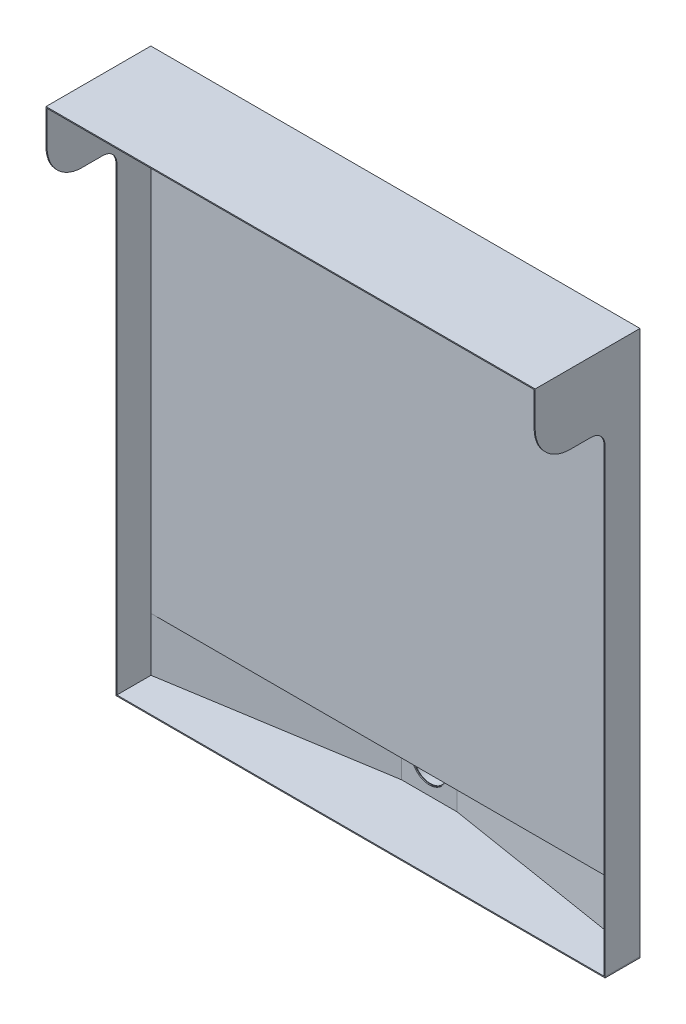
ISO-10303-21;
HEADER;
FILE_DESCRIPTION(('STEP AP214'),'2;1');
FILE_NAME('part.step','',(''),(''),'','','');
FILE_SCHEMA(('AUTOMOTIVE_DESIGN { 1 0 10303 214 1 1 1 1 }'));
ENDSEC;
DATA;
#1=APPLICATION_CONTEXT('core data for automotive mechanical design processes');
#2=APPLICATION_PROTOCOL_DEFINITION('international standard','automotive_design',2000,#1);
#3=PRODUCT_CONTEXT('',#1,'mechanical');
#4=PRODUCT('Part','Part','',(#3));
#5=PRODUCT_RELATED_PRODUCT_CATEGORY('part','',(#4));
#6=PRODUCT_DEFINITION_FORMATION('','',#4);
#7=PRODUCT_DEFINITION_CONTEXT('part definition',#1,'design');
#8=PRODUCT_DEFINITION('design','',#6,#7);
#9=PRODUCT_DEFINITION_SHAPE('','',#8);
#10=(LENGTH_UNIT() NAMED_UNIT(*) SI_UNIT(.MILLI.,.METRE.));
#11=(NAMED_UNIT(*) PLANE_ANGLE_UNIT() SI_UNIT($,.RADIAN.));
#12=(NAMED_UNIT(*) SI_UNIT($,.STERADIAN.) SOLID_ANGLE_UNIT());
#13=UNCERTAINTY_MEASURE_WITH_UNIT(LENGTH_MEASURE(1.E-05),#10,'distance_accuracy_value','');
#14=(GEOMETRIC_REPRESENTATION_CONTEXT(3) GLOBAL_UNCERTAINTY_ASSIGNED_CONTEXT((#13)) GLOBAL_UNIT_ASSIGNED_CONTEXT((#10,
#11,#12)) REPRESENTATION_CONTEXT('',''));
#15=CARTESIAN_POINT('',(0.,0.,0.));
#16=DIRECTION('',(0.,0.,1.));
#17=DIRECTION('',(1.,0.,0.));
#18=AXIS2_PLACEMENT_3D('',#15,#16,#17);
#19=CARTESIAN_POINT('',(0.,-350.,-75.));
#20=DIRECTION('',(0.,0.,-1.));
#21=DIRECTION('',(-1.,0.,0.));
#22=AXIS2_PLACEMENT_3D('',#19,#20,#21);
#23=PLANE('',#22);
#24=CARTESIAN_POINT('',(0.,-350.,-75.));
#25=DIRECTION('',(0.,0.,-1.));
#26=DIRECTION('',(-1.,0.,0.));
#27=AXIS2_PLACEMENT_3D('',#24,#25,#26);
#28=CIRCLE('',#27,25.);
#29=CARTESIAN_POINT('',(-25.,-350.,-75.));
#30=VERTEX_POINT('',#29);
#31=EDGE_CURVE('E12',#30,#30,#28,.T.);
#32=ORIENTED_EDGE('',*,*,#31,.T.);
#33=EDGE_LOOP('',(#32));
#34=FACE_BOUND('',#33,.T.);
#35=CARTESIAN_POINT('',(0.,-350.,-75.));
#36=DIRECTION('',(0.,0.,-1.));
#37=DIRECTION('',(-1.,0.,0.));
#38=AXIS2_PLACEMENT_3D('',#35,#36,#37);
#39=CIRCLE('',#38,24.);
#40=CARTESIAN_POINT('',(-24.,-350.,-75.));
#41=VERTEX_POINT('',#40);
#42=EDGE_CURVE('E73',#41,#41,#39,.T.);
#43=ORIENTED_EDGE('',*,*,#42,.F.);
#44=EDGE_LOOP('',(#43));
#45=FACE_BOUND('',#44,.T.);
#46=ADVANCED_FACE('F59',(#34,#45),#23,.T.);
#47=CARTESIAN_POINT('',(0.,-350.,-50.));
#48=DIRECTION('',(0.,0.,-1.));
#49=DIRECTION('',(-1.,0.,0.));
#50=AXIS2_PLACEMENT_3D('',#47,#48,#49);
#51=PLANE('',#50);
#52=CARTESIAN_POINT('',(0.,-350.,-50.));
#53=DIRECTION('',(0.,0.,-1.));
#54=DIRECTION('',(-1.,0.,0.));
#55=AXIS2_PLACEMENT_3D('',#52,#53,#54);
#56=CIRCLE('',#55,25.);
#57=CARTESIAN_POINT('',(-25.,-350.,-50.));
#58=VERTEX_POINT('',#57);
#59=EDGE_CURVE('E63',#58,#58,#56,.T.);
#60=ORIENTED_EDGE('',*,*,#59,.F.);
#61=EDGE_LOOP('',(#60));
#62=FACE_BOUND('',#61,.T.);
#63=CARTESIAN_POINT('',(0.,-350.,-50.));
#64=DIRECTION('',(0.,0.,-1.));
#65=DIRECTION('',(-1.,0.,0.));
#66=AXIS2_PLACEMENT_3D('',#63,#64,#65);
#67=CIRCLE('',#66,24.);
#68=CARTESIAN_POINT('',(-24.,-350.,-50.));
#69=VERTEX_POINT('',#68);
#70=EDGE_CURVE('E75',#69,#69,#67,.T.);
#71=ORIENTED_EDGE('',*,*,#70,.T.);
#72=EDGE_LOOP('',(#71));
#73=FACE_BOUND('',#72,.T.);
#74=ADVANCED_FACE('F86',(#62,#73),#51,.F.);
#75=CARTESIAN_POINT('',(0.,-350.,-75.));
#76=DIRECTION('',(0.,0.,1.));
#77=DIRECTION('',(1.,0.,0.));
#78=AXIS2_PLACEMENT_3D('',#75,#76,#77);
#79=CYLINDRICAL_SURFACE('',#78,25.);
#80=ORIENTED_EDGE('',*,*,#31,.F.);
#81=EDGE_LOOP('',(#80));
#82=FACE_BOUND('',#81,.T.);
#83=ORIENTED_EDGE('',*,*,#59,.T.);
#84=EDGE_LOOP('',(#83));
#85=FACE_BOUND('',#84,.T.);
#86=ADVANCED_FACE('F61',(#82,#85),#79,.T.);
#87=CARTESIAN_POINT('',(0.,-350.,-75.));
#88=DIRECTION('',(0.,0.,1.));
#89=DIRECTION('',(1.,0.,0.));
#90=AXIS2_PLACEMENT_3D('',#87,#88,#89);
#91=CYLINDRICAL_SURFACE('',#90,24.);
#92=ORIENTED_EDGE('',*,*,#42,.T.);
#93=EDGE_LOOP('',(#92));
#94=FACE_BOUND('',#93,.T.);
#95=ORIENTED_EDGE('',*,*,#70,.F.);
#96=EDGE_LOOP('',(#95));
#97=FACE_BOUND('',#96,.T.);
#98=ADVANCED_FACE('F82',(#94,#97),#91,.F.);
#99=CLOSED_SHELL('',(#46,#74,#86,#98));
#100=MANIFOLD_SOLID_BREP('B2',#99);
#101=CARTESIAN_POINT('',(-348.5,-388.5,150.));
#102=DIRECTION('',(0.,1.,0.));
#103=DIRECTION('',(-1.,0.,0.));
#104=AXIS2_PLACEMENT_3D('',#101,#102,#103);
#105=PLANE('',#104);
#106=DIRECTION('',(-1.,0.,0.));
#107=VECTOR('',#106,1.);
#108=CARTESIAN_POINT('',(-348.5,-388.5,50.0000000000001));
#109=LINE('',#108,#107);
#110=CARTESIAN_POINT('',(350.,-388.5,50.0000000000001));
#111=VERTEX_POINT('',#110);
#112=CARTESIAN_POINT('',(-350.,-388.5,50.0000000000001));
#113=VERTEX_POINT('',#112);
#114=EDGE_CURVE('E191',#111,#113,#109,.T.);
#115=ORIENTED_EDGE('',*,*,#114,.F.);
#116=DIRECTION('',(0.,0.,-1.));
#117=VECTOR('',#116,1.);
#118=CARTESIAN_POINT('',(350.,-388.5,150.));
#119=LINE('',#118,#117);
#120=CARTESIAN_POINT('',(350.,-388.5,0.));
#121=VERTEX_POINT('',#120);
#122=EDGE_CURVE('E199',#111,#121,#119,.T.);
#123=ORIENTED_EDGE('',*,*,#122,.T.);
#124=DIRECTION('',(0.987241120712647,0.,0.159232438824621));
#125=VECTOR('',#124,1.);
#126=CARTESIAN_POINT('',(40.0000000000001,-388.5,-50.));
#127=LINE('',#126,#125);
#128=CARTESIAN_POINT('',(40.0000000000001,-388.5,-50.));
#129=VERTEX_POINT('',#128);
#130=EDGE_CURVE('E249',#129,#121,#127,.T.);
#131=ORIENTED_EDGE('',*,*,#130,.F.);
#132=DIRECTION('',(1.,0.,0.));
#133=VECTOR('',#132,1.);
#134=CARTESIAN_POINT('',(40.0000000000001,-388.5,-50.));
#135=LINE('',#134,#133);
#136=CARTESIAN_POINT('',(-39.9999999999999,-388.5,-50.));
#137=VERTEX_POINT('',#136);
#138=EDGE_CURVE('E214',#137,#129,#135,.T.);
#139=ORIENTED_EDGE('',*,*,#138,.F.);
#140=DIRECTION('',(0.987241120712647,0.,-0.159232438824621));
#141=VECTOR('',#140,1.);
#142=CARTESIAN_POINT('',(-350.,-388.5,0.));
#143=LINE('',#142,#141);
#144=CARTESIAN_POINT('',(-350.,-388.5,0.));
#145=VERTEX_POINT('',#144);
#146=EDGE_CURVE('E212',#145,#137,#143,.T.);
#147=ORIENTED_EDGE('',*,*,#146,.F.);
#148=DIRECTION('',(0.,0.,1.));
#149=VECTOR('',#148,1.);
#150=CARTESIAN_POINT('',(-350.,-388.5,150.));
#151=LINE('',#150,#149);
#152=EDGE_CURVE('E206',#145,#113,#151,.T.);
#153=ORIENTED_EDGE('',*,*,#152,.T.);
#154=EDGE_LOOP('',(#115,#123,#131,#139,#147,#153));
#155=FACE_BOUND('',#154,.T.);
#156=ADVANCED_FACE('F138',(#155),#105,.T.);
#157=CARTESIAN_POINT('',(-350.,390.,150.));
#158=DIRECTION('',(1.,0.,0.));
#159=DIRECTION('',(0.,1.,0.));
#160=AXIS2_PLACEMENT_3D('',#157,#158,#159);
#161=PLANE('',#160);
#162=DIRECTION('',(0.,0.,-1.));
#163=VECTOR('',#162,1.);
#164=CARTESIAN_POINT('',(-350.,-390.,150.));
#165=LINE('',#164,#163);
#166=CARTESIAN_POINT('',(-350.,-390.,50.));
#167=VERTEX_POINT('',#166);
#168=CARTESIAN_POINT('',(-350.,-390.,0.));
#169=VERTEX_POINT('',#168);
#170=EDGE_CURVE('E208',#167,#169,#165,.T.);
#171=ORIENTED_EDGE('',*,*,#170,.F.);
#172=DIRECTION('',(0.,-1.,0.));
#173=VECTOR('',#172,1.);
#174=CARTESIAN_POINT('',(-350.,290.,50.));
#175=LINE('',#174,#173);
#176=EDGE_CURVE('E154',#113,#167,#175,.T.);
#177=ORIENTED_EDGE('',*,*,#176,.F.);
#178=ORIENTED_EDGE('',*,*,#152,.F.);
#179=DIRECTION('',(0.,-1.,0.));
#180=VECTOR('',#179,1.);
#181=CARTESIAN_POINT('',(-350.,-310.,0.));
#182=LINE('',#181,#180);
#183=EDGE_CURVE('E230',#145,#169,#182,.T.);
#184=ORIENTED_EDGE('',*,*,#183,.T.);
#185=EDGE_LOOP('',(#171,#177,#178,#184));
#186=FACE_BOUND('',#185,.T.);
#187=ADVANCED_FACE('F204',(#186),#161,.F.);
#188=CARTESIAN_POINT('',(350.,390.,150.));
#189=DIRECTION('',(-1.,0.,0.));
#190=DIRECTION('',(0.,-1.,0.));
#191=AXIS2_PLACEMENT_3D('',#188,#189,#190);
#192=PLANE('',#191);
#193=ORIENTED_EDGE('',*,*,#122,.F.);
#194=DIRECTION('',(0.,-1.,0.));
#195=VECTOR('',#194,1.);
#196=CARTESIAN_POINT('',(350.,290.,50.));
#197=LINE('',#196,#195);
#198=CARTESIAN_POINT('',(350.,-390.,50.0000000000001));
#199=VERTEX_POINT('',#198);
#200=EDGE_CURVE('E194',#111,#199,#197,.T.);
#201=ORIENTED_EDGE('',*,*,#200,.T.);
#202=DIRECTION('',(0.,0.,-1.));
#203=VECTOR('',#202,1.);
#204=CARTESIAN_POINT('',(350.,-390.,150.));
#205=LINE('',#204,#203);
#206=CARTESIAN_POINT('',(350.,-390.,0.));
#207=VERTEX_POINT('',#206);
#208=EDGE_CURVE('E227',#199,#207,#205,.T.);
#209=ORIENTED_EDGE('',*,*,#208,.T.);
#210=DIRECTION('',(0.,1.,0.));
#211=VECTOR('',#210,1.);
#212=CARTESIAN_POINT('',(350.,390.,0.));
#213=LINE('',#212,#211);
#214=EDGE_CURVE('E222',#207,#121,#213,.T.);
#215=ORIENTED_EDGE('',*,*,#214,.T.);
#216=EDGE_LOOP('',(#193,#201,#209,#215));
#217=FACE_BOUND('',#216,.T.);
#218=ADVANCED_FACE('F262',(#217),#192,.F.);
#219=CARTESIAN_POINT('',(40.0000000000001,-310.,-50.));
#220=DIRECTION('',(0.,0.,-1.));
#221=DIRECTION('',(-1.,0.,0.));
#222=AXIS2_PLACEMENT_3D('',#219,#220,#221);
#223=PLANE('',#222);
#224=DIRECTION('',(0.,-1.,0.));
#225=VECTOR('',#224,1.);
#226=CARTESIAN_POINT('',(-39.9999999999999,-310.,-50.));
#227=LINE('',#226,#225);
#228=CARTESIAN_POINT('',(-39.9999999999999,-390.,-50.));
#229=VERTEX_POINT('',#228);
#230=EDGE_CURVE('E226',#137,#229,#227,.T.);
#231=ORIENTED_EDGE('',*,*,#230,.F.);
#232=ORIENTED_EDGE('',*,*,#138,.T.);
#233=DIRECTION('',(0.,-1.,0.));
#234=VECTOR('',#233,1.);
#235=CARTESIAN_POINT('',(40.0000000000001,-310.,-50.));
#236=LINE('',#235,#234);
#237=CARTESIAN_POINT('',(40.0000000000001,-390.,-50.));
#238=VERTEX_POINT('',#237);
#239=EDGE_CURVE('E161',#129,#238,#236,.T.);
#240=ORIENTED_EDGE('',*,*,#239,.T.);
#241=DIRECTION('',(1.,0.,0.));
#242=VECTOR('',#241,1.);
#243=CARTESIAN_POINT('',(40.0000000000001,-390.,-50.));
#244=LINE('',#243,#242);
#245=EDGE_CURVE('E147',#229,#238,#244,.T.);
#246=ORIENTED_EDGE('',*,*,#245,.F.);
#247=EDGE_LOOP('',(#231,#232,#240,#246));
#248=FACE_BOUND('',#247,.T.);
#249=ADVANCED_FACE('F255',(#248),#223,.T.);
#250=CARTESIAN_POINT('',(-350.,-310.,0.));
#251=DIRECTION('',(-0.159232438824621,0.,-0.987241120712647));
#252=DIRECTION('',(-0.987241120712647,0.,0.159232438824621));
#253=AXIS2_PLACEMENT_3D('',#250,#251,#252);
#254=PLANE('',#253);
#255=ORIENTED_EDGE('',*,*,#183,.F.);
#256=ORIENTED_EDGE('',*,*,#146,.T.);
#257=ORIENTED_EDGE('',*,*,#230,.T.);
#258=DIRECTION('',(0.987241120712647,0.,-0.159232438824621));
#259=VECTOR('',#258,1.);
#260=CARTESIAN_POINT('',(-350.,-390.,0.));
#261=LINE('',#260,#259);
#262=EDGE_CURVE('E233',#169,#229,#261,.T.);
#263=ORIENTED_EDGE('',*,*,#262,.F.);
#264=EDGE_LOOP('',(#255,#256,#257,#263));
#265=FACE_BOUND('',#264,.T.);
#266=ADVANCED_FACE('F140',(#265),#254,.T.);
#267=CARTESIAN_POINT('',(40.0000000000001,-310.,-50.));
#268=DIRECTION('',(0.159232438824621,0.,-0.987241120712647));
#269=DIRECTION('',(-0.987241120712647,0.,-0.159232438824621));
#270=AXIS2_PLACEMENT_3D('',#267,#268,#269);
#271=PLANE('',#270);
#272=ORIENTED_EDGE('',*,*,#239,.F.);
#273=ORIENTED_EDGE('',*,*,#130,.T.);
#274=ORIENTED_EDGE('',*,*,#214,.F.);
#275=DIRECTION('',(0.987241120712647,0.,0.159232438824621));
#276=VECTOR('',#275,1.);
#277=CARTESIAN_POINT('',(40.0000000000001,-390.,-50.));
#278=LINE('',#277,#276);
#279=EDGE_CURVE('E236',#238,#207,#278,.T.);
#280=ORIENTED_EDGE('',*,*,#279,.F.);
#281=EDGE_LOOP('',(#272,#273,#274,#280));
#282=FACE_BOUND('',#281,.T.);
#283=ADVANCED_FACE('F260',(#282),#271,.T.);
#284=CARTESIAN_POINT('',(350.,-390.,150.));
#285=DIRECTION('',(0.,1.,0.));
#286=DIRECTION('',(-1.,0.,0.));
#287=AXIS2_PLACEMENT_3D('',#284,#285,#286);
#288=PLANE('',#287);
#289=ORIENTED_EDGE('',*,*,#208,.F.);
#290=DIRECTION('',(-1.,0.,0.));
#291=VECTOR('',#290,1.);
#292=CARTESIAN_POINT('',(350.,-390.,50.0000000000001));
#293=LINE('',#292,#291);
#294=EDGE_CURVE('E57',#199,#167,#293,.T.);
#295=ORIENTED_EDGE('',*,*,#294,.T.);
#296=ORIENTED_EDGE('',*,*,#170,.T.);
#297=ORIENTED_EDGE('',*,*,#262,.T.);
#298=ORIENTED_EDGE('',*,*,#245,.T.);
#299=ORIENTED_EDGE('',*,*,#279,.T.);
#300=EDGE_LOOP('',(#289,#295,#296,#297,#298,#299));
#301=FACE_BOUND('',#300,.T.);
#302=ADVANCED_FACE('F257',(#301),#288,.F.);
#303=CARTESIAN_POINT('',(350.,290.,50.));
#304=DIRECTION('',(0.,0.,-1.));
#305=DIRECTION('',(0.,1.,0.));
#306=AXIS2_PLACEMENT_3D('',#303,#304,#305);
#307=PLANE('',#306);
#308=ORIENTED_EDGE('',*,*,#114,.T.);
#309=ORIENTED_EDGE('',*,*,#176,.T.);
#310=ORIENTED_EDGE('',*,*,#294,.F.);
#311=ORIENTED_EDGE('',*,*,#200,.F.);
#312=EDGE_LOOP('',(#308,#309,#310,#311));
#313=FACE_BOUND('',#312,.T.);
#314=ADVANCED_FACE('F192',(#313),#307,.F.);
#315=CLOSED_SHELL('',(#156,#187,#218,#249,#266,#283,#302,#314));
#316=MANIFOLD_SOLID_BREP('B7',#315);
#317=CARTESIAN_POINT('',(0.,0.,150.));
#318=DIRECTION('',(0.,0.,-1.));
#319=DIRECTION('',(-1.,0.,0.));
#320=AXIS2_PLACEMENT_3D('',#317,#318,#319);
#321=PLANE('',#320);
#322=DIRECTION('',(0.,1.,0.));
#323=VECTOR('',#322,1.);
#324=CARTESIAN_POINT('',(348.5,0.,150.));
#325=LINE('',#324,#323);
#326=CARTESIAN_POINT('',(348.5,340.,150.));
#327=VERTEX_POINT('',#326);
#328=CARTESIAN_POINT('',(348.5,388.5,150.));
#329=VERTEX_POINT('',#328);
#330=EDGE_CURVE('E718',#327,#329,#325,.T.);
#331=ORIENTED_EDGE('',*,*,#330,.F.);
#332=DIRECTION('',(-1.,0.,0.));
#333=VECTOR('',#332,1.);
#334=CARTESIAN_POINT('',(350.,340.,150.));
#335=LINE('',#334,#333);
#336=CARTESIAN_POINT('',(350.,340.,150.));
#337=VERTEX_POINT('',#336);
#338=EDGE_CURVE('E592',#327,#337,#335,.F.);
#339=ORIENTED_EDGE('',*,*,#338,.T.);
#340=DIRECTION('',(0.,1.,0.));
#341=VECTOR('',#340,1.);
#342=CARTESIAN_POINT('',(350.,390.,150.));
#343=LINE('',#342,#341);
#344=CARTESIAN_POINT('',(350.,390.,150.));
#345=VERTEX_POINT('',#344);
#346=EDGE_CURVE('E613',#337,#345,#343,.T.);
#347=ORIENTED_EDGE('',*,*,#346,.T.);
#348=DIRECTION('',(-1.,0.,0.));
#349=VECTOR('',#348,1.);
#350=CARTESIAN_POINT('',(350.,390.,150.));
#351=LINE('',#350,#349);
#352=CARTESIAN_POINT('',(-350.,390.,150.));
#353=VERTEX_POINT('',#352);
#354=EDGE_CURVE('E610',#345,#353,#351,.T.);
#355=ORIENTED_EDGE('',*,*,#354,.T.);
#356=DIRECTION('',(0.,-1.,0.));
#357=VECTOR('',#356,1.);
#358=CARTESIAN_POINT('',(-350.,390.,150.));
#359=LINE('',#358,#357);
#360=CARTESIAN_POINT('',(-350.,340.,150.));
#361=VERTEX_POINT('',#360);
#362=EDGE_CURVE('E604',#353,#361,#359,.T.);
#363=ORIENTED_EDGE('',*,*,#362,.T.);
#364=DIRECTION('',(-1.,0.,0.));
#365=VECTOR('',#364,1.);
#366=CARTESIAN_POINT('',(-348.5,340.,150.));
#367=LINE('',#366,#365);
#368=CARTESIAN_POINT('',(-348.5,340.,150.));
#369=VERTEX_POINT('',#368);
#370=EDGE_CURVE('E589',#361,#369,#367,.F.);
#371=ORIENTED_EDGE('',*,*,#370,.T.);
#372=DIRECTION('',(0.,-1.,0.));
#373=VECTOR('',#372,1.);
#374=CARTESIAN_POINT('',(-348.5,0.,150.));
#375=LINE('',#374,#373);
#376=CARTESIAN_POINT('',(-348.5,388.5,150.));
#377=VERTEX_POINT('',#376);
#378=EDGE_CURVE('E660',#377,#369,#375,.T.);
#379=ORIENTED_EDGE('',*,*,#378,.F.);
#380=DIRECTION('',(-1.,0.,0.));
#381=VECTOR('',#380,1.);
#382=CARTESIAN_POINT('',(0.,388.5,150.));
#383=LINE('',#382,#381);
#384=EDGE_CURVE('E674',#329,#377,#383,.T.);
#385=ORIENTED_EDGE('',*,*,#384,.F.);
#386=EDGE_LOOP('',(#331,#339,#347,#355,#363,#371,#379,#385));
#387=FACE_BOUND('',#386,.T.);
#388=ADVANCED_FACE('F352',(#387),#321,.F.);
#389=CARTESIAN_POINT('',(-348.5,-388.5,150.));
#390=DIRECTION('',(0.,1.,0.));
#391=DIRECTION('',(-1.,0.,0.));
#392=AXIS2_PLACEMENT_3D('',#389,#390,#391);
#393=PLANE('',#392);
#394=DIRECTION('',(0.,0.,-1.));
#395=VECTOR('',#394,1.);
#396=CARTESIAN_POINT('',(350.,-388.5,150.));
#397=LINE('',#396,#395);
#398=CARTESIAN_POINT('',(350.,-388.5,50.0000000000001));
#399=VERTEX_POINT('',#398);
#400=CARTESIAN_POINT('',(350.,-388.5,0.));
#401=VERTEX_POINT('',#400);
#402=EDGE_CURVE('E543',#399,#401,#397,.T.);
#403=ORIENTED_EDGE('',*,*,#402,.F.);
#404=DIRECTION('',(-1.,0.,0.));
#405=VECTOR('',#404,1.);
#406=CARTESIAN_POINT('',(-348.5,-388.5,50.0000000000001));
#407=LINE('',#406,#405);
#408=CARTESIAN_POINT('',(348.5,-388.5,50.0000000000001));
#409=VERTEX_POINT('',#408);
#410=EDGE_CURVE('E535',#399,#409,#407,.T.);
#411=ORIENTED_EDGE('',*,*,#410,.T.);
#412=DIRECTION('',(0.,0.,-1.));
#413=VECTOR('',#412,1.);
#414=CARTESIAN_POINT('',(348.5,-388.5,150.));
#415=LINE('',#414,#413);
#416=CARTESIAN_POINT('',(348.5,-388.5,1.277450174333));
#417=VERTEX_POINT('',#416);
#418=EDGE_CURVE('E559',#409,#417,#415,.T.);
#419=ORIENTED_EDGE('',*,*,#418,.T.);
#420=DIRECTION('',(0.987241120712647,0.,0.159232438824621));
#421=VECTOR('',#420,1.);
#422=CARTESIAN_POINT('',(39.7611513417631,-388.5,-48.519138318931));
#423=LINE('',#422,#421);
#424=CARTESIAN_POINT('',(39.8798089191355,-388.5,-48.5));
#425=VERTEX_POINT('',#424);
#426=EDGE_CURVE('E679',#425,#417,#423,.T.);
#427=ORIENTED_EDGE('',*,*,#426,.F.);
#428=DIRECTION('',(1.,0.,0.));
#429=VECTOR('',#428,1.);
#430=CARTESIAN_POINT('',(40.0000000000001,-388.5,-48.5));
#431=LINE('',#430,#429);
#432=CARTESIAN_POINT('',(-39.8798089191354,-388.5,-48.5));
#433=VERTEX_POINT('',#432);
#434=EDGE_CURVE('E680',#433,#425,#431,.T.);
#435=ORIENTED_EDGE('',*,*,#434,.F.);
#436=DIRECTION('',(0.987241120712647,0.,-0.159232438824621));
#437=VECTOR('',#436,1.);
#438=CARTESIAN_POINT('',(-349.761151341763,-388.5,1.48086168106897));
#439=LINE('',#438,#437);
#440=CARTESIAN_POINT('',(-348.5,-388.5,1.27745017433299));
#441=VERTEX_POINT('',#440);
#442=EDGE_CURVE('E675',#441,#433,#439,.T.);
#443=ORIENTED_EDGE('',*,*,#442,.F.);
#444=DIRECTION('',(0.,0.,-1.));
#445=VECTOR('',#444,1.);
#446=CARTESIAN_POINT('',(-348.5,-388.5,150.));
#447=LINE('',#446,#445);
#448=CARTESIAN_POINT('',(-348.5,-388.5,50.0000000000001));
#449=VERTEX_POINT('',#448);
#450=EDGE_CURVE('E530',#449,#441,#447,.T.);
#451=ORIENTED_EDGE('',*,*,#450,.F.);
#452=CARTESIAN_POINT('',(-350.,-388.5,50.0000000000001));
#453=VERTEX_POINT('',#452);
#454=EDGE_CURVE('E511',#449,#453,#407,.T.);
#455=ORIENTED_EDGE('',*,*,#454,.T.);
#456=DIRECTION('',(0.,0.,1.));
#457=VECTOR('',#456,1.);
#458=CARTESIAN_POINT('',(-350.,-388.5,150.));
#459=LINE('',#458,#457);
#460=CARTESIAN_POINT('',(-350.,-388.5,0.));
#461=VERTEX_POINT('',#460);
#462=EDGE_CURVE('E527',#461,#453,#459,.T.);
#463=ORIENTED_EDGE('',*,*,#462,.F.);
#464=DIRECTION('',(0.987241120712647,0.,-0.159232438824621));
#465=VECTOR('',#464,1.);
#466=CARTESIAN_POINT('',(-350.,-388.5,0.));
#467=LINE('',#466,#465);
#468=CARTESIAN_POINT('',(-39.9999999999999,-388.5,-50.));
#469=VERTEX_POINT('',#468);
#470=EDGE_CURVE('E549',#461,#469,#467,.T.);
#471=ORIENTED_EDGE('',*,*,#470,.T.);
#472=DIRECTION('',(1.,0.,0.));
#473=VECTOR('',#472,1.);
#474=CARTESIAN_POINT('',(40.0000000000001,-388.5,-50.));
#475=LINE('',#474,#473);
#476=CARTESIAN_POINT('',(40.0000000000001,-388.5,-50.));
#477=VERTEX_POINT('',#476);
#478=EDGE_CURVE('E542',#469,#477,#475,.T.);
#479=ORIENTED_EDGE('',*,*,#478,.T.);
#480=DIRECTION('',(0.987241120712647,0.,0.159232438824621));
#481=VECTOR('',#480,1.);
#482=CARTESIAN_POINT('',(40.0000000000001,-388.5,-50.));
#483=LINE('',#482,#481);
#484=EDGE_CURVE('E688',#477,#401,#483,.T.);
#485=ORIENTED_EDGE('',*,*,#484,.T.);
#486=EDGE_LOOP('',(#403,#411,#419,#427,#435,#443,#451,#455,#463,#471,#479,#485));
#487=FACE_BOUND('',#486,.T.);
#488=ADVANCED_FACE('F525',(#487),#393,.F.);
#489=CARTESIAN_POINT('',(350.,390.,150.));
#490=DIRECTION('',(0.,-1.,0.));
#491=DIRECTION('',(1.,0.,0.));
#492=AXIS2_PLACEMENT_3D('',#489,#490,#491);
#493=PLANE('',#492);
#494=DIRECTION('',(-1.,0.,0.));
#495=VECTOR('',#494,1.);
#496=CARTESIAN_POINT('',(350.,390.,0.));
#497=LINE('',#496,#495);
#498=CARTESIAN_POINT('',(350.,390.,0.));
#499=VERTEX_POINT('',#498);
#500=CARTESIAN_POINT('',(-350.,390.,0.));
#501=VERTEX_POINT('',#500);
#502=EDGE_CURVE('E614',#499,#501,#497,.T.);
#503=ORIENTED_EDGE('',*,*,#502,.T.);
#504=DIRECTION('',(0.,0.,-1.));
#505=VECTOR('',#504,1.);
#506=CARTESIAN_POINT('',(-350.,390.,150.));
#507=LINE('',#506,#505);
#508=EDGE_CURVE('E751',#353,#501,#507,.T.);
#509=ORIENTED_EDGE('',*,*,#508,.F.);
#510=ORIENTED_EDGE('',*,*,#354,.F.);
#511=DIRECTION('',(0.,0.,-1.));
#512=VECTOR('',#511,1.);
#513=CARTESIAN_POINT('',(350.,390.,150.));
#514=LINE('',#513,#512);
#515=EDGE_CURVE('E552',#345,#499,#514,.T.);
#516=ORIENTED_EDGE('',*,*,#515,.T.);
#517=EDGE_LOOP('',(#503,#509,#510,#516));
#518=FACE_BOUND('',#517,.T.);
#519=ADVANCED_FACE('F794',(#518),#493,.F.);
#520=CARTESIAN_POINT('',(0.,0.,0.));
#521=DIRECTION('',(0.,0.,-1.));
#522=DIRECTION('',(-1.,0.,0.));
#523=AXIS2_PLACEMENT_3D('',#520,#521,#522);
#524=PLANE('',#523);
#525=DIRECTION('',(0.,1.,0.));
#526=VECTOR('',#525,1.);
#527=CARTESIAN_POINT('',(350.,390.,0.));
#528=LINE('',#527,#526);
#529=CARTESIAN_POINT('',(350.,-310.,0.));
#530=VERTEX_POINT('',#529);
#531=EDGE_CURVE('E754',#530,#499,#528,.T.);
#532=ORIENTED_EDGE('',*,*,#531,.F.);
#533=DIRECTION('',(-1.,0.,0.));
#534=VECTOR('',#533,1.);
#535=CARTESIAN_POINT('',(350.,-310.,0.));
#536=LINE('',#535,#534);
#537=CARTESIAN_POINT('',(-350.,-310.,0.));
#538=VERTEX_POINT('',#537);
#539=EDGE_CURVE('E730',#530,#538,#536,.T.);
#540=ORIENTED_EDGE('',*,*,#539,.T.);
#541=DIRECTION('',(0.,-1.,0.));
#542=VECTOR('',#541,1.);
#543=CARTESIAN_POINT('',(-350.,390.,0.));
#544=LINE('',#543,#542);
#545=EDGE_CURVE('E742',#501,#538,#544,.T.);
#546=ORIENTED_EDGE('',*,*,#545,.F.);
#547=ORIENTED_EDGE('',*,*,#502,.F.);
#548=EDGE_LOOP('',(#532,#540,#546,#547));
#549=FACE_BOUND('',#548,.T.);
#550=ADVANCED_FACE('F786',(#549),#524,.T.);
#551=CARTESIAN_POINT('',(0.,0.,1.5));
#552=DIRECTION('',(0.,0.,-1.));
#553=DIRECTION('',(-1.,0.,0.));
#554=AXIS2_PLACEMENT_3D('',#551,#552,#553);
#555=PLANE('',#554);
#556=DIRECTION('',(0.,1.,0.));
#557=VECTOR('',#556,1.);
#558=CARTESIAN_POINT('',(348.5,0.,1.5));
#559=LINE('',#558,#557);
#560=CARTESIAN_POINT('',(348.5,-311.5,1.5));
#561=VERTEX_POINT('',#560);
#562=CARTESIAN_POINT('',(348.5,388.5,1.5));
#563=VERTEX_POINT('',#562);
#564=EDGE_CURVE('E642',#561,#563,#559,.T.);
#565=ORIENTED_EDGE('',*,*,#564,.T.);
#566=DIRECTION('',(-1.,0.,0.));
#567=VECTOR('',#566,1.);
#568=CARTESIAN_POINT('',(0.,388.5,1.5));
#569=LINE('',#568,#567);
#570=CARTESIAN_POINT('',(-348.5,388.5,1.5));
#571=VERTEX_POINT('',#570);
#572=EDGE_CURVE('E657',#563,#571,#569,.T.);
#573=ORIENTED_EDGE('',*,*,#572,.T.);
#574=DIRECTION('',(0.,-1.,0.));
#575=VECTOR('',#574,1.);
#576=CARTESIAN_POINT('',(-348.5,0.,1.5));
#577=LINE('',#576,#575);
#578=CARTESIAN_POINT('',(-348.5,-311.5,1.5));
#579=VERTEX_POINT('',#578);
#580=EDGE_CURVE('E646',#571,#579,#577,.T.);
#581=ORIENTED_EDGE('',*,*,#580,.T.);
#582=DIRECTION('',(-1.,0.,0.));
#583=VECTOR('',#582,1.);
#584=CARTESIAN_POINT('',(0.,-311.5,1.5));
#585=LINE('',#584,#583);
#586=EDGE_CURVE('E647',#561,#579,#585,.T.);
#587=ORIENTED_EDGE('',*,*,#586,.F.);
#588=EDGE_LOOP('',(#565,#573,#581,#587));
#589=FACE_BOUND('',#588,.T.);
#590=ADVANCED_FACE('F800',(#589),#555,.F.);
#591=CARTESIAN_POINT('',(350.,388.5,150.));
#592=DIRECTION('',(0.,-1.,0.));
#593=DIRECTION('',(1.,0.,0.));
#594=AXIS2_PLACEMENT_3D('',#591,#592,#593);
#595=PLANE('',#594);
#596=ORIENTED_EDGE('',*,*,#572,.F.);
#597=DIRECTION('',(0.,0.,-1.));
#598=VECTOR('',#597,1.);
#599=CARTESIAN_POINT('',(348.5,388.5,150.));
#600=LINE('',#599,#598);
#601=EDGE_CURVE('E669',#329,#563,#600,.T.);
#602=ORIENTED_EDGE('',*,*,#601,.F.);
#603=ORIENTED_EDGE('',*,*,#384,.T.);
#604=DIRECTION('',(0.,0.,-1.));
#605=VECTOR('',#604,1.);
#606=CARTESIAN_POINT('',(-348.5,388.5,150.));
#607=LINE('',#606,#605);
#608=EDGE_CURVE('E670',#377,#571,#607,.T.);
#609=ORIENTED_EDGE('',*,*,#608,.T.);
#610=EDGE_LOOP('',(#596,#602,#603,#609));
#611=FACE_BOUND('',#610,.T.);
#612=ADVANCED_FACE('F837',(#611),#595,.T.);
#613=CARTESIAN_POINT('',(0.,-350.,150.));
#614=DIRECTION('',(0.,0.,-1.));
#615=DIRECTION('',(-1.,0.,0.));
#616=AXIS2_PLACEMENT_3D('',#613,#614,#615);
#617=CYLINDRICAL_SURFACE('',#616,25.);
#618=CARTESIAN_POINT('',(0.,-350.,-50.));
#619=DIRECTION('',(0.,0.,-1.));
#620=DIRECTION('',(-1.,0.,0.));
#621=AXIS2_PLACEMENT_3D('',#618,#619,#620);
#622=CIRCLE('',#621,25.);
#623=CARTESIAN_POINT('',(-25.,-350.,-50.));
#624=VERTEX_POINT('',#623);
#625=EDGE_CURVE('E532',#624,#624,#622,.T.);
#626=ORIENTED_EDGE('',*,*,#625,.T.);
#627=EDGE_LOOP('',(#626));
#628=FACE_BOUND('',#627,.T.);
#629=CARTESIAN_POINT('',(0.,-350.,-48.5));
#630=DIRECTION('',(0.,0.,-1.));
#631=DIRECTION('',(-1.,0.,0.));
#632=AXIS2_PLACEMENT_3D('',#629,#630,#631);
#633=CIRCLE('',#632,25.);
#634=CARTESIAN_POINT('',(-25.,-350.,-48.5));
#635=VERTEX_POINT('',#634);
#636=EDGE_CURVE('E641',#635,#635,#633,.T.);
#637=ORIENTED_EDGE('',*,*,#636,.F.);
#638=EDGE_LOOP('',(#637));
#639=FACE_BOUND('',#638,.T.);
#640=ADVANCED_FACE('F840',(#628,#639),#617,.F.);
#641=CARTESIAN_POINT('',(-348.5,390.,150.));
#642=DIRECTION('',(1.,0.,0.));
#643=DIRECTION('',(0.,1.,0.));
#644=AXIS2_PLACEMENT_3D('',#641,#642,#643);
#645=PLANE('',#644);
#646=ORIENTED_EDGE('',*,*,#378,.T.);
#647=CARTESIAN_POINT('',(-348.5,340.,100.));
#648=DIRECTION('',(1.,0.,0.));
#649=DIRECTION('',(0.,1.,0.));
#650=AXIS2_PLACEMENT_3D('',#647,#648,#649);
#651=CIRCLE('',#650,50.);
#652=CARTESIAN_POINT('',(-348.5,290.,100.));
#653=VERTEX_POINT('',#652);
#654=EDGE_CURVE('E136',#369,#653,#651,.T.);
#655=ORIENTED_EDGE('',*,*,#654,.T.);
#656=DIRECTION('',(0.,0.,-1.));
#657=VECTOR('',#656,1.);
#658=CARTESIAN_POINT('',(-348.5,290.,150.));
#659=LINE('',#658,#657);
#660=CARTESIAN_POINT('',(-348.5,290.,70.));
#661=VERTEX_POINT('',#660);
#662=EDGE_CURVE('E619',#653,#661,#659,.T.);
#663=ORIENTED_EDGE('',*,*,#662,.T.);
#664=CARTESIAN_POINT('',(-348.5,270.,70.));
#665=DIRECTION('',(1.,0.,0.));
#666=DIRECTION('',(0.,1.,0.));
#667=AXIS2_PLACEMENT_3D('',#664,#665,#666);
#668=CIRCLE('',#667,20.);
#669=CARTESIAN_POINT('',(-348.5,270.,50.));
#670=VERTEX_POINT('',#669);
#671=EDGE_CURVE('E573',#661,#670,#668,.F.);
#672=ORIENTED_EDGE('',*,*,#671,.T.);
#673=DIRECTION('',(0.,1.,0.));
#674=VECTOR('',#673,1.);
#675=CARTESIAN_POINT('',(-348.5,390.,50.));
#676=LINE('',#675,#674);
#677=EDGE_CURVE('E533',#449,#670,#676,.T.);
#678=ORIENTED_EDGE('',*,*,#677,.F.);
#679=ORIENTED_EDGE('',*,*,#450,.T.);
#680=DIRECTION('',(0.,-1.,0.));
#681=VECTOR('',#680,1.);
#682=CARTESIAN_POINT('',(-348.5,-310.,1.27745017433299));
#683=LINE('',#682,#681);
#684=CARTESIAN_POINT('',(-348.5,-311.5,1.27745017433298));
#685=VERTEX_POINT('',#684);
#686=EDGE_CURVE('E661',#685,#441,#683,.T.);
#687=ORIENTED_EDGE('',*,*,#686,.F.);
#688=DIRECTION('',(0.,0.,-1.));
#689=VECTOR('',#688,1.);
#690=CARTESIAN_POINT('',(-348.5,-311.5,149.999999999999));
#691=LINE('',#690,#689);
#692=EDGE_CURVE('E711',#579,#685,#691,.T.);
#693=ORIENTED_EDGE('',*,*,#692,.F.);
#694=ORIENTED_EDGE('',*,*,#580,.F.);
#695=ORIENTED_EDGE('',*,*,#608,.F.);
#696=EDGE_LOOP('',(#646,#655,#663,#672,#678,#679,#687,#693,#694,#695));
#697=FACE_BOUND('',#696,.T.);
#698=ADVANCED_FACE('F835',(#697),#645,.T.);
#699=CARTESIAN_POINT('',(40.0000000000001,-310.,-48.5));
#700=DIRECTION('',(0.,0.,-1.));
#701=DIRECTION('',(-1.,0.,0.));
#702=AXIS2_PLACEMENT_3D('',#699,#700,#701);
#703=PLANE('',#702);
#704=ORIENTED_EDGE('',*,*,#636,.T.);
#705=EDGE_LOOP('',(#704));
#706=FACE_BOUND('',#705,.T.);
#707=ORIENTED_EDGE('',*,*,#434,.T.);
#708=DIRECTION('',(0.,-1.,0.));
#709=VECTOR('',#708,1.);
#710=CARTESIAN_POINT('',(39.8798089191355,-310.,-48.5));
#711=LINE('',#710,#709);
#712=CARTESIAN_POINT('',(39.8798089191355,-311.5,-48.5));
#713=VERTEX_POINT('',#712);
#714=EDGE_CURVE('E665',#713,#425,#711,.T.);
#715=ORIENTED_EDGE('',*,*,#714,.F.);
#716=DIRECTION('',(1.,0.,0.));
#717=VECTOR('',#716,1.);
#718=CARTESIAN_POINT('',(0.,-311.5,-48.5));
#719=LINE('',#718,#717);
#720=CARTESIAN_POINT('',(-39.8798089191354,-311.5,-48.5));
#721=VERTEX_POINT('',#720);
#722=EDGE_CURVE('E678',#721,#713,#719,.T.);
#723=ORIENTED_EDGE('',*,*,#722,.F.);
#724=DIRECTION('',(0.,-1.,0.));
#725=VECTOR('',#724,1.);
#726=CARTESIAN_POINT('',(-39.8798089191354,-310.,-48.5));
#727=LINE('',#726,#725);
#728=EDGE_CURVE('E656',#721,#433,#727,.T.);
#729=ORIENTED_EDGE('',*,*,#728,.T.);
#730=EDGE_LOOP('',(#707,#715,#723,#729));
#731=FACE_BOUND('',#730,.T.);
#732=ADVANCED_FACE('F823',(#706,#731),#703,.F.);
#733=CARTESIAN_POINT('',(0.,-311.5,-4.34652314140749E-13));
#734=DIRECTION('',(0.,-1.,0.));
#735=DIRECTION('',(0.,0.,-1.));
#736=AXIS2_PLACEMENT_3D('',#733,#734,#735);
#737=PLANE('',#736);
#738=ORIENTED_EDGE('',*,*,#722,.T.);
#739=DIRECTION('',(0.987241120712647,0.,0.159232438824621));
#740=VECTOR('',#739,1.);
#741=CARTESIAN_POINT('',(8.63539069267576,-311.5,-53.5394222945903));
#742=LINE('',#741,#740);
#743=CARTESIAN_POINT('',(348.5,-311.5,1.27745017433301));
#744=VERTEX_POINT('',#743);
#745=EDGE_CURVE('E652',#713,#744,#742,.T.);
#746=ORIENTED_EDGE('',*,*,#745,.T.);
#747=DIRECTION('',(0.,0.,-1.));
#748=VECTOR('',#747,1.);
#749=CARTESIAN_POINT('',(348.5,-311.5,-4.34652314140749E-13));
#750=LINE('',#749,#748);
#751=EDGE_CURVE('E668',#561,#744,#750,.T.);
#752=ORIENTED_EDGE('',*,*,#751,.F.);
#753=ORIENTED_EDGE('',*,*,#586,.T.);
#754=ORIENTED_EDGE('',*,*,#692,.T.);
#755=DIRECTION('',(0.987241120712647,0.,-0.159232438824621));
#756=VECTOR('',#755,1.);
#757=CARTESIAN_POINT('',(-8.6353906926758,-311.5,-53.5394222945903));
#758=LINE('',#757,#756);
#759=EDGE_CURVE('E651',#685,#721,#758,.T.);
#760=ORIENTED_EDGE('',*,*,#759,.T.);
#761=EDGE_LOOP('',(#738,#746,#752,#753,#754,#760));
#762=FACE_BOUND('',#761,.T.);
#763=ADVANCED_FACE('F819',(#762),#737,.T.);
#764=CARTESIAN_POINT('',(348.5,390.,150.));
#765=DIRECTION('',(-1.,0.,0.));
#766=DIRECTION('',(0.,-1.,0.));
#767=AXIS2_PLACEMENT_3D('',#764,#765,#766);
#768=PLANE('',#767);
#769=DIRECTION('',(0.,0.,1.));
#770=VECTOR('',#769,1.);
#771=CARTESIAN_POINT('',(348.5,290.,150.));
#772=LINE('',#771,#770);
#773=CARTESIAN_POINT('',(348.5,290.,70.));
#774=VERTEX_POINT('',#773);
#775=CARTESIAN_POINT('',(348.5,290.,100.));
#776=VERTEX_POINT('',#775);
#777=EDGE_CURVE('E623',#774,#776,#772,.T.);
#778=ORIENTED_EDGE('',*,*,#777,.T.);
#779=CARTESIAN_POINT('',(348.5,340.,100.));
#780=DIRECTION('',(-1.,0.,0.));
#781=DIRECTION('',(0.,-1.,0.));
#782=AXIS2_PLACEMENT_3D('',#779,#780,#781);
#783=CIRCLE('',#782,50.);
#784=EDGE_CURVE('E586',#776,#327,#783,.T.);
#785=ORIENTED_EDGE('',*,*,#784,.T.);
#786=ORIENTED_EDGE('',*,*,#330,.T.);
#787=ORIENTED_EDGE('',*,*,#601,.T.);
#788=ORIENTED_EDGE('',*,*,#564,.F.);
#789=ORIENTED_EDGE('',*,*,#751,.T.);
#790=DIRECTION('',(0.,1.,0.));
#791=VECTOR('',#790,1.);
#792=CARTESIAN_POINT('',(348.5,-310.,1.27745017433301));
#793=LINE('',#792,#791);
#794=EDGE_CURVE('E645',#417,#744,#793,.T.);
#795=ORIENTED_EDGE('',*,*,#794,.F.);
#796=ORIENTED_EDGE('',*,*,#418,.F.);
#797=DIRECTION('',(0.,-1.,0.));
#798=VECTOR('',#797,1.);
#799=CARTESIAN_POINT('',(348.5,390.,50.));
#800=LINE('',#799,#798);
#801=CARTESIAN_POINT('',(348.5,270.,50.));
#802=VERTEX_POINT('',#801);
#803=EDGE_CURVE('E622',#802,#409,#800,.T.);
#804=ORIENTED_EDGE('',*,*,#803,.F.);
#805=CARTESIAN_POINT('',(348.5,270.,70.));
#806=DIRECTION('',(-1.,0.,0.));
#807=DIRECTION('',(0.,-1.,0.));
#808=AXIS2_PLACEMENT_3D('',#805,#806,#807);
#809=CIRCLE('',#808,20.);
#810=EDGE_CURVE('E576',#802,#774,#809,.F.);
#811=ORIENTED_EDGE('',*,*,#810,.T.);
#812=EDGE_LOOP('',(#778,#785,#786,#787,#788,#789,#795,#796,#804,#811));
#813=FACE_BOUND('',#812,.T.);
#814=ADVANCED_FACE('F822',(#813),#768,.T.);
#815=CARTESIAN_POINT('',(39.7611513417631,-310.,-48.519138318931));
#816=DIRECTION('',(0.159232438824621,0.,-0.987241120712647));
#817=DIRECTION('',(-0.987241120712647,0.,-0.159232438824621));
#818=AXIS2_PLACEMENT_3D('',#815,#816,#817);
#819=PLANE('',#818);
#820=ORIENTED_EDGE('',*,*,#426,.T.);
#821=ORIENTED_EDGE('',*,*,#794,.T.);
#822=ORIENTED_EDGE('',*,*,#745,.F.);
#823=ORIENTED_EDGE('',*,*,#714,.T.);
#824=EDGE_LOOP('',(#820,#821,#822,#823));
#825=FACE_BOUND('',#824,.T.);
#826=ADVANCED_FACE('F825',(#825),#819,.F.);
#827=CARTESIAN_POINT('',(-349.761151341763,-310.,1.48086168106897));
#828=DIRECTION('',(-0.159232438824621,0.,-0.987241120712647));
#829=DIRECTION('',(-0.987241120712647,0.,0.159232438824621));
#830=AXIS2_PLACEMENT_3D('',#827,#828,#829);
#831=PLANE('',#830);
#832=ORIENTED_EDGE('',*,*,#442,.T.);
#833=ORIENTED_EDGE('',*,*,#728,.F.);
#834=ORIENTED_EDGE('',*,*,#759,.F.);
#835=ORIENTED_EDGE('',*,*,#686,.T.);
#836=EDGE_LOOP('',(#832,#833,#834,#835));
#837=FACE_BOUND('',#836,.T.);
#838=ADVANCED_FACE('F828',(#837),#831,.F.);
#839=CARTESIAN_POINT('',(350.,390.,150.));
#840=DIRECTION('',(-1.,0.,0.));
#841=DIRECTION('',(0.,-1.,0.));
#842=AXIS2_PLACEMENT_3D('',#839,#840,#841);
#843=PLANE('',#842);
#844=ORIENTED_EDGE('',*,*,#346,.F.);
#845=CARTESIAN_POINT('',(350.,340.,100.));
#846=DIRECTION('',(-1.,0.,0.));
#847=DIRECTION('',(0.,-1.,0.));
#848=AXIS2_PLACEMENT_3D('',#845,#846,#847);
#849=CIRCLE('',#848,50.);
#850=CARTESIAN_POINT('',(350.,290.,100.));
#851=VERTEX_POINT('',#850);
#852=EDGE_CURVE('E595',#337,#851,#849,.F.);
#853=ORIENTED_EDGE('',*,*,#852,.T.);
#854=DIRECTION('',(0.,0.,1.));
#855=VECTOR('',#854,1.);
#856=CARTESIAN_POINT('',(350.,290.,50.));
#857=LINE('',#856,#855);
#858=CARTESIAN_POINT('',(350.,290.,70.));
#859=VERTEX_POINT('',#858);
#860=EDGE_CURVE('E518',#859,#851,#857,.T.);
#861=ORIENTED_EDGE('',*,*,#860,.F.);
#862=CARTESIAN_POINT('',(350.,270.,70.));
#863=DIRECTION('',(-1.,0.,0.));
#864=DIRECTION('',(0.,-1.,0.));
#865=AXIS2_PLACEMENT_3D('',#862,#863,#864);
#866=CIRCLE('',#865,20.);
#867=CARTESIAN_POINT('',(350.,270.,50.));
#868=VERTEX_POINT('',#867);
#869=EDGE_CURVE('E579',#859,#868,#866,.T.);
#870=ORIENTED_EDGE('',*,*,#869,.T.);
#871=DIRECTION('',(0.,-1.,0.));
#872=VECTOR('',#871,1.);
#873=CARTESIAN_POINT('',(350.,290.,50.));
#874=LINE('',#873,#872);
#875=EDGE_CURVE('E631',#868,#399,#874,.T.);
#876=ORIENTED_EDGE('',*,*,#875,.T.);
#877=ORIENTED_EDGE('',*,*,#402,.T.);
#878=EDGE_CURVE('E755',#401,#530,#528,.T.);
#879=ORIENTED_EDGE('',*,*,#878,.T.);
#880=ORIENTED_EDGE('',*,*,#531,.T.);
#881=ORIENTED_EDGE('',*,*,#515,.F.);
#882=EDGE_LOOP('',(#844,#853,#861,#870,#876,#877,#879,#880,#881));
#883=FACE_BOUND('',#882,.T.);
#884=ADVANCED_FACE('F792',(#883),#843,.F.);
#885=CARTESIAN_POINT('',(0.,-310.,-4.32986979603811E-13));
#886=DIRECTION('',(0.,-1.,0.));
#887=DIRECTION('',(0.,0.,-1.));
#888=AXIS2_PLACEMENT_3D('',#885,#886,#887);
#889=PLANE('',#888);
#890=DIRECTION('',(1.,0.,0.));
#891=VECTOR('',#890,1.);
#892=CARTESIAN_POINT('',(40.0000000000001,-310.,-50.));
#893=LINE('',#892,#891);
#894=CARTESIAN_POINT('',(-39.9999999999999,-310.,-50.));
#895=VERTEX_POINT('',#894);
#896=CARTESIAN_POINT('',(40.0000000000001,-310.,-50.));
#897=VERTEX_POINT('',#896);
#898=EDGE_CURVE('E715',#895,#897,#893,.T.);
#899=ORIENTED_EDGE('',*,*,#898,.F.);
#900=DIRECTION('',(0.987241120712647,0.,-0.159232438824621));
#901=VECTOR('',#900,1.);
#902=CARTESIAN_POINT('',(-350.,-310.,0.));
#903=LINE('',#902,#901);
#904=EDGE_CURVE('E733',#538,#895,#903,.T.);
#905=ORIENTED_EDGE('',*,*,#904,.F.);
#906=ORIENTED_EDGE('',*,*,#539,.F.);
#907=DIRECTION('',(0.987241120712647,0.,0.159232438824621));
#908=VECTOR('',#907,1.);
#909=CARTESIAN_POINT('',(40.0000000000001,-310.,-50.));
#910=LINE('',#909,#908);
#911=EDGE_CURVE('E726',#897,#530,#910,.T.);
#912=ORIENTED_EDGE('',*,*,#911,.F.);
#913=EDGE_LOOP('',(#899,#905,#906,#912));
#914=FACE_BOUND('',#913,.T.);
#915=ADVANCED_FACE('F779',(#914),#889,.F.);
#916=CARTESIAN_POINT('',(40.0000000000001,-310.,-50.));
#917=DIRECTION('',(0.,0.,-1.));
#918=DIRECTION('',(-1.,0.,0.));
#919=AXIS2_PLACEMENT_3D('',#916,#917,#918);
#920=PLANE('',#919);
#921=ORIENTED_EDGE('',*,*,#478,.F.);
#922=DIRECTION('',(0.,-1.,0.));
#923=VECTOR('',#922,1.);
#924=CARTESIAN_POINT('',(-39.9999999999999,-310.,-50.));
#925=LINE('',#924,#923);
#926=EDGE_CURVE('E738',#895,#469,#925,.T.);
#927=ORIENTED_EDGE('',*,*,#926,.F.);
#928=ORIENTED_EDGE('',*,*,#898,.T.);
#929=DIRECTION('',(0.,-1.,0.));
#930=VECTOR('',#929,1.);
#931=CARTESIAN_POINT('',(40.0000000000001,-310.,-50.));
#932=LINE('',#931,#930);
#933=EDGE_CURVE('E737',#897,#477,#932,.T.);
#934=ORIENTED_EDGE('',*,*,#933,.T.);
#935=EDGE_LOOP('',(#921,#927,#928,#934));
#936=FACE_BOUND('',#935,.T.);
#937=ORIENTED_EDGE('',*,*,#625,.F.);
#938=EDGE_LOOP('',(#937));
#939=FACE_BOUND('',#938,.T.);
#940=ADVANCED_FACE('F775',(#936,#939),#920,.T.);
#941=CARTESIAN_POINT('',(40.0000000000001,-310.,-50.));
#942=DIRECTION('',(0.159232438824621,0.,-0.987241120712647));
#943=DIRECTION('',(-0.987241120712647,0.,-0.159232438824621));
#944=AXIS2_PLACEMENT_3D('',#941,#942,#943);
#945=PLANE('',#944);
#946=ORIENTED_EDGE('',*,*,#484,.F.);
#947=ORIENTED_EDGE('',*,*,#933,.F.);
#948=ORIENTED_EDGE('',*,*,#911,.T.);
#949=ORIENTED_EDGE('',*,*,#878,.F.);
#950=EDGE_LOOP('',(#946,#947,#948,#949));
#951=FACE_BOUND('',#950,.T.);
#952=ADVANCED_FACE('F783',(#951),#945,.T.);
#953=CARTESIAN_POINT('',(-350.,390.,150.));
#954=DIRECTION('',(1.,0.,0.));
#955=DIRECTION('',(0.,1.,0.));
#956=AXIS2_PLACEMENT_3D('',#953,#954,#955);
#957=PLANE('',#956);
#958=DIRECTION('',(0.,0.,1.));
#959=VECTOR('',#958,1.);
#960=CARTESIAN_POINT('',(-350.,290.,50.));
#961=LINE('',#960,#959);
#962=CARTESIAN_POINT('',(-350.,290.,70.));
#963=VERTEX_POINT('',#962);
#964=CARTESIAN_POINT('',(-350.,290.,100.));
#965=VERTEX_POINT('',#964);
#966=EDGE_CURVE('E519',#963,#965,#961,.T.);
#967=ORIENTED_EDGE('',*,*,#966,.T.);
#968=CARTESIAN_POINT('',(-350.,340.,100.));
#969=DIRECTION('',(1.,0.,0.));
#970=DIRECTION('',(0.,1.,0.));
#971=AXIS2_PLACEMENT_3D('',#968,#969,#970);
#972=CIRCLE('',#971,50.);
#973=EDGE_CURVE('E361',#965,#361,#972,.F.);
#974=ORIENTED_EDGE('',*,*,#973,.T.);
#975=ORIENTED_EDGE('',*,*,#362,.F.);
#976=ORIENTED_EDGE('',*,*,#508,.T.);
#977=ORIENTED_EDGE('',*,*,#545,.T.);
#978=DIRECTION('',(0.,-1.,0.));
#979=VECTOR('',#978,1.);
#980=CARTESIAN_POINT('',(-350.,-310.,0.));
#981=LINE('',#980,#979);
#982=EDGE_CURVE('E540',#538,#461,#981,.T.);
#983=ORIENTED_EDGE('',*,*,#982,.T.);
#984=ORIENTED_EDGE('',*,*,#462,.T.);
#985=DIRECTION('',(0.,-1.,0.));
#986=VECTOR('',#985,1.);
#987=CARTESIAN_POINT('',(-350.,290.,50.));
#988=LINE('',#987,#986);
#989=CARTESIAN_POINT('',(-350.,270.,50.));
#990=VERTEX_POINT('',#989);
#991=EDGE_CURVE('E507',#990,#453,#988,.T.);
#992=ORIENTED_EDGE('',*,*,#991,.F.);
#993=CARTESIAN_POINT('',(-350.,270.,70.));
#994=DIRECTION('',(1.,0.,0.));
#995=DIRECTION('',(0.,1.,0.));
#996=AXIS2_PLACEMENT_3D('',#993,#994,#995);
#997=CIRCLE('',#996,20.);
#998=EDGE_CURVE('E570',#990,#963,#997,.T.);
#999=ORIENTED_EDGE('',*,*,#998,.T.);
#1000=EDGE_LOOP('',(#967,#974,#975,#976,#977,#983,#984,#992,#999));
#1001=FACE_BOUND('',#1000,.T.);
#1002=ADVANCED_FACE('F537',(#1001),#957,.F.);
#1003=CARTESIAN_POINT('',(-350.,-310.,0.));
#1004=DIRECTION('',(-0.159232438824621,0.,-0.987241120712647));
#1005=DIRECTION('',(-0.987241120712647,0.,0.159232438824621));
#1006=AXIS2_PLACEMENT_3D('',#1003,#1004,#1005);
#1007=PLANE('',#1006);
#1008=ORIENTED_EDGE('',*,*,#470,.F.);
#1009=ORIENTED_EDGE('',*,*,#982,.F.);
#1010=ORIENTED_EDGE('',*,*,#904,.T.);
#1011=ORIENTED_EDGE('',*,*,#926,.T.);
#1012=EDGE_LOOP('',(#1008,#1009,#1010,#1011));
#1013=FACE_BOUND('',#1012,.T.);
#1014=ADVANCED_FACE('F772',(#1013),#1007,.T.);
#1015=CARTESIAN_POINT('',(350.,290.,50.));
#1016=DIRECTION('',(0.,-1.,0.));
#1017=DIRECTION('',(1.,0.,0.));
#1018=AXIS2_PLACEMENT_3D('',#1015,#1016,#1017);
#1019=PLANE('',#1018);
#1020=ORIENTED_EDGE('',*,*,#662,.F.);
#1021=DIRECTION('',(-1.,0.,0.));
#1022=VECTOR('',#1021,1.);
#1023=CARTESIAN_POINT('',(-350.,290.,100.));
#1024=LINE('',#1023,#1022);
#1025=EDGE_CURVE('E598',#653,#965,#1024,.T.);
#1026=ORIENTED_EDGE('',*,*,#1025,.T.);
#1027=ORIENTED_EDGE('',*,*,#966,.F.);
#1028=DIRECTION('',(-1.,0.,0.));
#1029=VECTOR('',#1028,1.);
#1030=CARTESIAN_POINT('',(350.,290.,70.));
#1031=LINE('',#1030,#1029);
#1032=EDGE_CURVE('E558',#963,#661,#1031,.F.);
#1033=ORIENTED_EDGE('',*,*,#1032,.T.);
#1034=EDGE_LOOP('',(#1020,#1026,#1027,#1033));
#1035=FACE_BOUND('',#1034,.T.);
#1036=ADVANCED_FACE('F617',(#1035),#1019,.T.);
#1037=CARTESIAN_POINT('',(350.,290.,50.));
#1038=DIRECTION('',(0.,0.,-1.));
#1039=DIRECTION('',(0.,1.,0.));
#1040=AXIS2_PLACEMENT_3D('',#1037,#1038,#1039);
#1041=PLANE('',#1040);
#1042=ORIENTED_EDGE('',*,*,#677,.T.);
#1043=DIRECTION('',(-1.,0.,0.));
#1044=VECTOR('',#1043,1.);
#1045=CARTESIAN_POINT('',(350.,270.,50.));
#1046=LINE('',#1045,#1044);
#1047=EDGE_CURVE('E514',#670,#990,#1046,.T.);
#1048=ORIENTED_EDGE('',*,*,#1047,.T.);
#1049=ORIENTED_EDGE('',*,*,#991,.T.);
#1050=ORIENTED_EDGE('',*,*,#454,.F.);
#1051=EDGE_LOOP('',(#1042,#1048,#1049,#1050));
#1052=FACE_BOUND('',#1051,.T.);
#1053=ADVANCED_FACE('F510',(#1052),#1041,.F.);
#1054=ORIENTED_EDGE('',*,*,#875,.F.);
#1055=DIRECTION('',(-1.,0.,0.));
#1056=VECTOR('',#1055,1.);
#1057=CARTESIAN_POINT('',(350.,270.,50.));
#1058=LINE('',#1057,#1056);
#1059=EDGE_CURVE('E563',#868,#802,#1058,.T.);
#1060=ORIENTED_EDGE('',*,*,#1059,.T.);
#1061=ORIENTED_EDGE('',*,*,#803,.T.);
#1062=ORIENTED_EDGE('',*,*,#410,.F.);
#1063=EDGE_LOOP('',(#1054,#1060,#1061,#1062));
#1064=FACE_BOUND('',#1063,.T.);
#1065=ADVANCED_FACE('F854',(#1064),#1041,.F.);
#1066=ORIENTED_EDGE('',*,*,#860,.T.);
#1067=DIRECTION('',(-1.,0.,0.));
#1068=VECTOR('',#1067,1.);
#1069=CARTESIAN_POINT('',(348.5,290.,100.));
#1070=LINE('',#1069,#1068);
#1071=EDGE_CURVE('E582',#851,#776,#1070,.T.);
#1072=ORIENTED_EDGE('',*,*,#1071,.T.);
#1073=ORIENTED_EDGE('',*,*,#777,.F.);
#1074=DIRECTION('',(-1.,0.,0.));
#1075=VECTOR('',#1074,1.);
#1076=CARTESIAN_POINT('',(350.,290.,70.));
#1077=LINE('',#1076,#1075);
#1078=EDGE_CURVE('E567',#774,#859,#1077,.F.);
#1079=ORIENTED_EDGE('',*,*,#1078,.T.);
#1080=EDGE_LOOP('',(#1066,#1072,#1073,#1079));
#1081=FACE_BOUND('',#1080,.T.);
#1082=ADVANCED_FACE('F806',(#1081),#1019,.T.);
#1083=CARTESIAN_POINT('',(350.,270.,70.));
#1084=DIRECTION('',(-1.,0.,0.));
#1085=DIRECTION('',(0.,-1.,0.));
#1086=AXIS2_PLACEMENT_3D('',#1083,#1084,#1085);
#1087=CYLINDRICAL_SURFACE('',#1086,20.);
#1088=ORIENTED_EDGE('',*,*,#671,.F.);
#1089=ORIENTED_EDGE('',*,*,#1032,.F.);
#1090=ORIENTED_EDGE('',*,*,#998,.F.);
#1091=ORIENTED_EDGE('',*,*,#1047,.F.);
#1092=EDGE_LOOP('',(#1088,#1089,#1090,#1091));
#1093=FACE_BOUND('',#1092,.T.);
#1094=ADVANCED_FACE('F860',(#1093),#1087,.F.);
#1095=CARTESIAN_POINT('',(350.,270.,70.));
#1096=DIRECTION('',(-1.,0.,0.));
#1097=DIRECTION('',(0.,-1.,0.));
#1098=AXIS2_PLACEMENT_3D('',#1095,#1096,#1097);
#1099=CYLINDRICAL_SURFACE('',#1098,20.);
#1100=ORIENTED_EDGE('',*,*,#869,.F.);
#1101=ORIENTED_EDGE('',*,*,#1078,.F.);
#1102=ORIENTED_EDGE('',*,*,#810,.F.);
#1103=ORIENTED_EDGE('',*,*,#1059,.F.);
#1104=EDGE_LOOP('',(#1100,#1101,#1102,#1103));
#1105=FACE_BOUND('',#1104,.T.);
#1106=ADVANCED_FACE('F870',(#1105),#1099,.F.);
#1107=CARTESIAN_POINT('',(350.,340.,100.));
#1108=DIRECTION('',(1.,0.,0.));
#1109=DIRECTION('',(0.,1.,0.));
#1110=AXIS2_PLACEMENT_3D('',#1107,#1108,#1109);
#1111=CYLINDRICAL_SURFACE('',#1110,50.);
#1112=ORIENTED_EDGE('',*,*,#852,.F.);
#1113=ORIENTED_EDGE('',*,*,#338,.F.);
#1114=ORIENTED_EDGE('',*,*,#784,.F.);
#1115=ORIENTED_EDGE('',*,*,#1071,.F.);
#1116=EDGE_LOOP('',(#1112,#1113,#1114,#1115));
#1117=FACE_BOUND('',#1116,.T.);
#1118=ADVANCED_FACE('F879',(#1117),#1111,.T.);
#1119=CARTESIAN_POINT('',(350.,340.,100.));
#1120=DIRECTION('',(1.,0.,0.));
#1121=DIRECTION('',(0.,1.,0.));
#1122=AXIS2_PLACEMENT_3D('',#1119,#1120,#1121);
#1123=CYLINDRICAL_SURFACE('',#1122,50.);
#1124=ORIENTED_EDGE('',*,*,#654,.F.);
#1125=ORIENTED_EDGE('',*,*,#370,.F.);
#1126=ORIENTED_EDGE('',*,*,#973,.F.);
#1127=ORIENTED_EDGE('',*,*,#1025,.F.);
#1128=EDGE_LOOP('',(#1124,#1125,#1126,#1127));
#1129=FACE_BOUND('',#1128,.T.);
#1130=ADVANCED_FACE('F354',(#1129),#1123,.T.);
#1131=CLOSED_SHELL('',(#388,#488,#519,#550,#590,#612,#640,#698,#732,#763,#814,#826,#838,#884,
#915,#940,#952,#1002,#1014,#1036,#1053,#1065,#1082,#1094,#1106,#1118,#1130));
#1132=MANIFOLD_SOLID_BREP('B51',#1131);
#1133=ADVANCED_BREP_SHAPE_REPRESENTATION('',(#18,#100,#316,#1132),#14);
#1134=SHAPE_DEFINITION_REPRESENTATION(#9,#1133);
ENDSEC;
END-ISO-10303-21;
